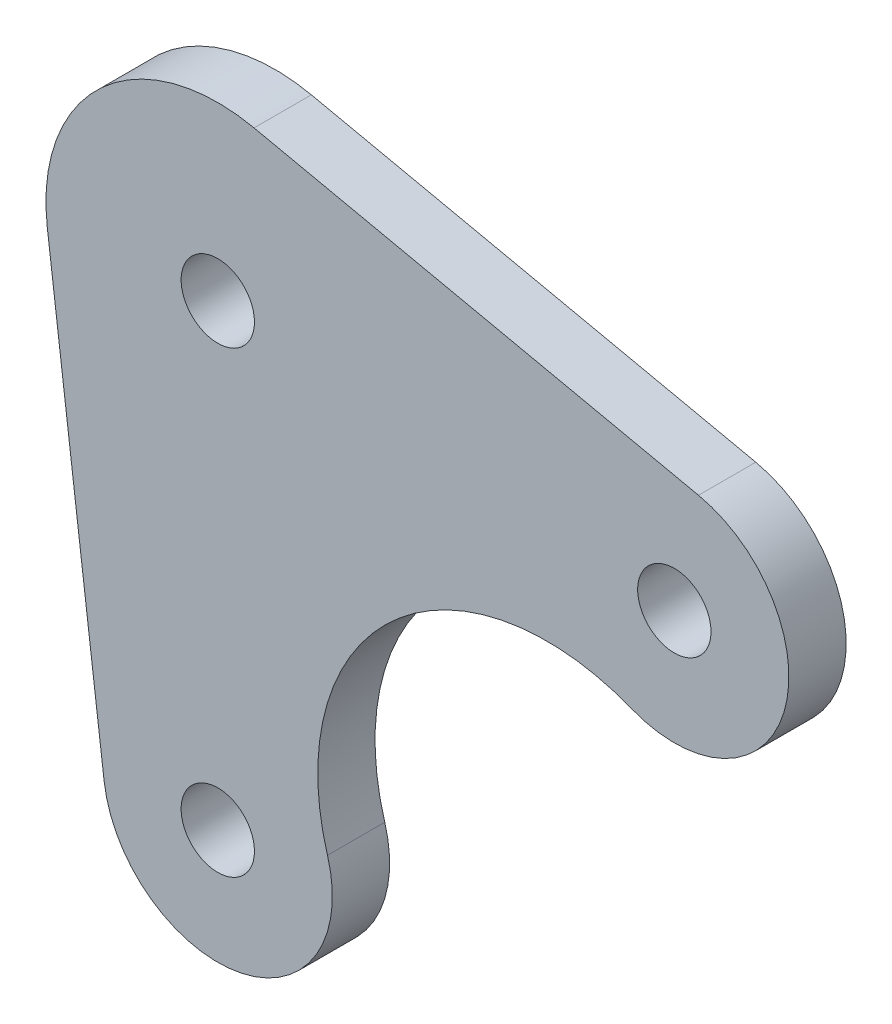
ISO-10303-21;
HEADER;
FILE_DESCRIPTION(('STEP AP214'),'2;1');
FILE_NAME('part.step','',(''),(''),'','','');
FILE_SCHEMA(('AUTOMOTIVE_DESIGN { 1 0 10303 214 1 1 1 1 }'));
ENDSEC;
DATA;
#1=APPLICATION_CONTEXT('core data for automotive mechanical design processes');
#2=APPLICATION_PROTOCOL_DEFINITION('international standard','automotive_design',2000,#1);
#3=PRODUCT_CONTEXT('',#1,'mechanical');
#4=PRODUCT('Part','Part','',(#3));
#5=PRODUCT_RELATED_PRODUCT_CATEGORY('part','',(#4));
#6=PRODUCT_DEFINITION_FORMATION('','',#4);
#7=PRODUCT_DEFINITION_CONTEXT('part definition',#1,'design');
#8=PRODUCT_DEFINITION('design','',#6,#7);
#9=PRODUCT_DEFINITION_SHAPE('','',#8);
#10=(LENGTH_UNIT() NAMED_UNIT(*) SI_UNIT(.MILLI.,.METRE.));
#11=(NAMED_UNIT(*) PLANE_ANGLE_UNIT() SI_UNIT($,.RADIAN.));
#12=(NAMED_UNIT(*) SI_UNIT($,.STERADIAN.) SOLID_ANGLE_UNIT());
#13=UNCERTAINTY_MEASURE_WITH_UNIT(LENGTH_MEASURE(1.E-05),#10,'distance_accuracy_value','');
#14=(GEOMETRIC_REPRESENTATION_CONTEXT(3) GLOBAL_UNCERTAINTY_ASSIGNED_CONTEXT((#13)) GLOBAL_UNIT_ASSIGNED_CONTEXT((#10,
#11,#12)) REPRESENTATION_CONTEXT('',''));
#15=CARTESIAN_POINT('',(0.,0.,0.));
#16=DIRECTION('',(0.,0.,1.));
#17=DIRECTION('',(1.,0.,0.));
#18=AXIS2_PLACEMENT_3D('',#15,#16,#17);
#19=CARTESIAN_POINT('',(0.,0.,3.175));
#20=DIRECTION('',(0.,0.,1.));
#21=DIRECTION('',(1.,0.,0.));
#22=AXIS2_PLACEMENT_3D('',#19,#20,#21);
#23=PLANE('',#22);
#24=CARTESIAN_POINT('',(25.3033453315303,-2.21375586579061,3.175));
#25=DIRECTION('',(0.,0.,1.));
#26=DIRECTION('',(1.,0.,0.));
#27=AXIS2_PLACEMENT_3D('',#24,#25,#26);
#28=CIRCLE('',#27,2.032);
#29=CARTESIAN_POINT('',(27.3353453315303,-2.21375586579061,3.175));
#30=VERTEX_POINT('',#29);
#31=EDGE_CURVE('E190',#30,#30,#28,.T.);
#32=ORIENTED_EDGE('',*,*,#31,.F.);
#33=EDGE_LOOP('',(#32));
#34=FACE_BOUND('',#33,.T.);
#35=CARTESIAN_POINT('',(0.,0.,3.175));
#36=DIRECTION('',(0.,0.,1.));
#37=DIRECTION('',(1.,0.,0.));
#38=AXIS2_PLACEMENT_3D('',#35,#36,#37);
#39=CIRCLE('',#38,9.525);
#40=CARTESIAN_POINT('',(2.00974161489411,9.31056194014963,3.175));
#41=VERTEX_POINT('',#40);
#42=CARTESIAN_POINT('',(-9.45029296420883,-1.190625,3.175));
#43=VERTEX_POINT('',#42);
#44=EDGE_CURVE('E135',#41,#43,#39,.T.);
#45=ORIENTED_EDGE('',*,*,#44,.T.);
#46=DIRECTION('',(0.125,-0.992156741649221,0.));
#47=VECTOR('',#46,1.);
#48=CARTESIAN_POINT('',(-6.30019530947255,-26.19375,3.175));
#49=LINE('',#48,#47);
#50=CARTESIAN_POINT('',(-6.30019530947255,-26.19375,3.175));
#51=VERTEX_POINT('',#50);
#52=EDGE_CURVE('E93',#43,#51,#49,.T.);
#53=ORIENTED_EDGE('',*,*,#52,.T.);
#54=CARTESIAN_POINT('',(0.,-25.4,3.175));
#55=DIRECTION('',(0.,0.,1.));
#56=DIRECTION('',(1.,0.,0.));
#57=AXIS2_PLACEMENT_3D('',#54,#55,#56);
#58=CIRCLE('',#57,6.35);
#59=CARTESIAN_POINT('',(6.0802042799938,-23.5687119523284,3.175));
#60=VERTEX_POINT('',#59);
#61=EDGE_CURVE('E106',#51,#60,#58,.T.);
#62=ORIENTED_EDGE('',*,*,#61,.T.);
#63=CARTESIAN_POINT('',(18.2406128399814,-19.9061358569851,3.175));
#64=DIRECTION('',(0.,0.,-1.));
#65=DIRECTION('',(1.,0.,0.));
#66=AXIS2_PLACEMENT_3D('',#63,#64,#65);
#67=CIRCLE('',#66,12.7);
#68=CARTESIAN_POINT('',(22.9491011676807,-8.11121586285545,3.175));
#69=VERTEX_POINT('',#68);
#70=EDGE_CURVE('E100',#60,#69,#67,.T.);
#71=ORIENTED_EDGE('',*,*,#70,.T.);
#72=CARTESIAN_POINT('',(25.3033453315303,-2.21375586579061,3.175));
#73=DIRECTION('',(0.,0.,1.));
#74=DIRECTION('',(-1.,0.,0.));
#75=AXIS2_PLACEMENT_3D('',#72,#73,#74);
#76=CIRCLE('',#75,6.35);
#77=CARTESIAN_POINT('',(26.6431730747931,3.99328542764247,3.175));
#78=VERTEX_POINT('',#77);
#79=EDGE_CURVE('E104',#69,#78,#76,.T.);
#80=ORIENTED_EDGE('',*,*,#79,.T.);
#81=DIRECTION('',(-0.977486817863478,0.210996495002006,0.));
#82=VECTOR('',#81,1.);
#83=CARTESIAN_POINT('',(2.00974161489411,9.31056194014963,3.175));
#84=LINE('',#83,#82);
#85=EDGE_CURVE('E56',#78,#41,#84,.T.);
#86=ORIENTED_EDGE('',*,*,#85,.T.);
#87=EDGE_LOOP('',(#45,#53,#62,#71,#80,#86));
#88=FACE_BOUND('',#87,.T.);
#89=CARTESIAN_POINT('',(0.,0.,3.175));
#90=DIRECTION('',(0.,0.,1.));
#91=DIRECTION('',(1.,0.,0.));
#92=AXIS2_PLACEMENT_3D('',#89,#90,#91);
#93=CIRCLE('',#92,2.032);
#94=CARTESIAN_POINT('',(2.032,0.,3.175));
#95=VERTEX_POINT('',#94);
#96=EDGE_CURVE('E128',#95,#95,#93,.T.);
#97=ORIENTED_EDGE('',*,*,#96,.F.);
#98=EDGE_LOOP('',(#97));
#99=FACE_BOUND('',#98,.T.);
#100=CARTESIAN_POINT('',(0.,-25.4,3.175));
#101=DIRECTION('',(0.,0.,1.));
#102=DIRECTION('',(1.,0.,0.));
#103=AXIS2_PLACEMENT_3D('',#100,#101,#102);
#104=CIRCLE('',#103,2.032);
#105=CARTESIAN_POINT('',(2.032,-25.4,3.175));
#106=VERTEX_POINT('',#105);
#107=EDGE_CURVE('E181',#106,#106,#104,.T.);
#108=ORIENTED_EDGE('',*,*,#107,.F.);
#109=EDGE_LOOP('',(#108));
#110=FACE_BOUND('',#109,.T.);
#111=ADVANCED_FACE('F39',(#34,#88,#99,#110),#23,.T.);
#112=CARTESIAN_POINT('',(0.,0.,0.));
#113=DIRECTION('',(0.,0.,1.));
#114=DIRECTION('',(1.,0.,0.));
#115=AXIS2_PLACEMENT_3D('',#112,#113,#114);
#116=PLANE('',#115);
#117=CARTESIAN_POINT('',(0.,0.,0.));
#118=DIRECTION('',(0.,0.,1.));
#119=DIRECTION('',(1.,0.,0.));
#120=AXIS2_PLACEMENT_3D('',#117,#118,#119);
#121=CIRCLE('',#120,9.525);
#122=CARTESIAN_POINT('',(2.00974161489411,9.31056194014963,0.));
#123=VERTEX_POINT('',#122);
#124=CARTESIAN_POINT('',(-9.45029296420883,-1.190625,0.));
#125=VERTEX_POINT('',#124);
#126=EDGE_CURVE('E124',#123,#125,#121,.T.);
#127=ORIENTED_EDGE('',*,*,#126,.F.);
#128=DIRECTION('',(-0.977486817863478,0.210996495002006,0.));
#129=VECTOR('',#128,1.);
#130=CARTESIAN_POINT('',(2.00974161489411,9.31056194014963,0.));
#131=LINE('',#130,#129);
#132=CARTESIAN_POINT('',(26.6431730747931,3.99328542764247,0.));
#133=VERTEX_POINT('',#132);
#134=EDGE_CURVE('E85',#133,#123,#131,.T.);
#135=ORIENTED_EDGE('',*,*,#134,.F.);
#136=CARTESIAN_POINT('',(25.3033453315303,-2.21375586579061,0.));
#137=DIRECTION('',(0.,0.,1.));
#138=DIRECTION('',(-1.,0.,0.));
#139=AXIS2_PLACEMENT_3D('',#136,#137,#138);
#140=CIRCLE('',#139,6.35);
#141=CARTESIAN_POINT('',(22.9491011676807,-8.11121586285545,0.));
#142=VERTEX_POINT('',#141);
#143=EDGE_CURVE('E79',#142,#133,#140,.T.);
#144=ORIENTED_EDGE('',*,*,#143,.F.);
#145=CARTESIAN_POINT('',(18.2406128399814,-19.9061358569851,0.));
#146=DIRECTION('',(0.,0.,-1.));
#147=DIRECTION('',(1.,0.,0.));
#148=AXIS2_PLACEMENT_3D('',#145,#146,#147);
#149=CIRCLE('',#148,12.7);
#150=CARTESIAN_POINT('',(6.0802042799938,-23.5687119523284,0.));
#151=VERTEX_POINT('',#150);
#152=EDGE_CURVE('E114',#151,#142,#149,.T.);
#153=ORIENTED_EDGE('',*,*,#152,.F.);
#154=CARTESIAN_POINT('',(0.,-25.4,0.));
#155=DIRECTION('',(0.,0.,1.));
#156=DIRECTION('',(1.,0.,0.));
#157=AXIS2_PLACEMENT_3D('',#154,#155,#156);
#158=CIRCLE('',#157,6.35);
#159=CARTESIAN_POINT('',(-6.30019530947255,-26.19375,0.));
#160=VERTEX_POINT('',#159);
#161=EDGE_CURVE('E130',#160,#151,#158,.T.);
#162=ORIENTED_EDGE('',*,*,#161,.F.);
#163=DIRECTION('',(0.125,-0.992156741649221,0.));
#164=VECTOR('',#163,1.);
#165=CARTESIAN_POINT('',(-6.30019530947255,-26.19375,0.));
#166=LINE('',#165,#164);
#167=EDGE_CURVE('E127',#125,#160,#166,.T.);
#168=ORIENTED_EDGE('',*,*,#167,.F.);
#169=EDGE_LOOP('',(#127,#135,#144,#153,#162,#168));
#170=FACE_BOUND('',#169,.T.);
#171=CARTESIAN_POINT('',(0.,0.,0.));
#172=DIRECTION('',(0.,0.,1.));
#173=DIRECTION('',(1.,0.,0.));
#174=AXIS2_PLACEMENT_3D('',#171,#172,#173);
#175=CIRCLE('',#174,2.032);
#176=CARTESIAN_POINT('',(2.032,0.,0.));
#177=VERTEX_POINT('',#176);
#178=EDGE_CURVE('E193',#177,#177,#175,.T.);
#179=ORIENTED_EDGE('',*,*,#178,.T.);
#180=EDGE_LOOP('',(#179));
#181=FACE_BOUND('',#180,.T.);
#182=CARTESIAN_POINT('',(25.3033453315303,-2.21375586579061,0.));
#183=DIRECTION('',(0.,0.,1.));
#184=DIRECTION('',(1.,0.,0.));
#185=AXIS2_PLACEMENT_3D('',#182,#183,#184);
#186=CIRCLE('',#185,2.032);
#187=CARTESIAN_POINT('',(27.3353453315303,-2.21375586579061,0.));
#188=VERTEX_POINT('',#187);
#189=EDGE_CURVE('E187',#188,#188,#186,.T.);
#190=ORIENTED_EDGE('',*,*,#189,.T.);
#191=EDGE_LOOP('',(#190));
#192=FACE_BOUND('',#191,.T.);
#193=CARTESIAN_POINT('',(0.,-25.4,0.));
#194=DIRECTION('',(0.,0.,1.));
#195=DIRECTION('',(1.,0.,0.));
#196=AXIS2_PLACEMENT_3D('',#193,#194,#195);
#197=CIRCLE('',#196,2.032);
#198=CARTESIAN_POINT('',(2.032,-25.4,0.));
#199=VERTEX_POINT('',#198);
#200=EDGE_CURVE('E184',#199,#199,#197,.T.);
#201=ORIENTED_EDGE('',*,*,#200,.T.);
#202=EDGE_LOOP('',(#201));
#203=FACE_BOUND('',#202,.T.);
#204=ADVANCED_FACE('F144',(#170,#181,#192,#203),#116,.F.);
#205=CARTESIAN_POINT('',(0.,0.,3.175));
#206=DIRECTION('',(0.,0.,-1.));
#207=DIRECTION('',(-1.,0.,0.));
#208=AXIS2_PLACEMENT_3D('',#205,#206,#207);
#209=CYLINDRICAL_SURFACE('',#208,9.525);
#210=ORIENTED_EDGE('',*,*,#126,.T.);
#211=DIRECTION('',(0.,0.,-1.));
#212=VECTOR('',#211,1.);
#213=CARTESIAN_POINT('',(-9.45029296420883,-1.190625,3.175));
#214=LINE('',#213,#212);
#215=EDGE_CURVE('E11',#43,#125,#214,.T.);
#216=ORIENTED_EDGE('',*,*,#215,.F.);
#217=ORIENTED_EDGE('',*,*,#44,.F.);
#218=DIRECTION('',(0.,0.,-1.));
#219=VECTOR('',#218,1.);
#220=CARTESIAN_POINT('',(2.00974161489411,9.31056194014963,3.175));
#221=LINE('',#220,#219);
#222=EDGE_CURVE('E120',#41,#123,#221,.T.);
#223=ORIENTED_EDGE('',*,*,#222,.T.);
#224=EDGE_LOOP('',(#210,#216,#217,#223));
#225=FACE_BOUND('',#224,.T.);
#226=ADVANCED_FACE('F41',(#225),#209,.T.);
#227=CARTESIAN_POINT('',(-6.30019530947255,-26.19375,3.175));
#228=DIRECTION('',(0.992156741649221,0.125,0.));
#229=DIRECTION('',(-0.125,0.992156741649222,0.));
#230=AXIS2_PLACEMENT_3D('',#227,#228,#229);
#231=PLANE('',#230);
#232=ORIENTED_EDGE('',*,*,#167,.T.);
#233=DIRECTION('',(0.,0.,-1.));
#234=VECTOR('',#233,1.);
#235=CARTESIAN_POINT('',(-6.30019530947255,-26.19375,3.175));
#236=LINE('',#235,#234);
#237=EDGE_CURVE('E48',#51,#160,#236,.T.);
#238=ORIENTED_EDGE('',*,*,#237,.F.);
#239=ORIENTED_EDGE('',*,*,#52,.F.);
#240=ORIENTED_EDGE('',*,*,#215,.T.);
#241=EDGE_LOOP('',(#232,#238,#239,#240));
#242=FACE_BOUND('',#241,.T.);
#243=ADVANCED_FACE('F246',(#242),#231,.F.);
#244=CARTESIAN_POINT('',(0.,-25.4,3.175));
#245=DIRECTION('',(0.,0.,-1.));
#246=DIRECTION('',(-1.,0.,0.));
#247=AXIS2_PLACEMENT_3D('',#244,#245,#246);
#248=CYLINDRICAL_SURFACE('',#247,6.35);
#249=ORIENTED_EDGE('',*,*,#161,.T.);
#250=DIRECTION('',(0.,0.,-1.));
#251=VECTOR('',#250,1.);
#252=CARTESIAN_POINT('',(6.0802042799938,-23.5687119523284,3.175));
#253=LINE('',#252,#251);
#254=EDGE_CURVE('E115',#60,#151,#253,.T.);
#255=ORIENTED_EDGE('',*,*,#254,.F.);
#256=ORIENTED_EDGE('',*,*,#61,.F.);
#257=ORIENTED_EDGE('',*,*,#237,.T.);
#258=EDGE_LOOP('',(#249,#255,#256,#257));
#259=FACE_BOUND('',#258,.T.);
#260=ADVANCED_FACE('F141',(#259),#248,.T.);
#261=CARTESIAN_POINT('',(18.2406128399814,-19.9061358569851,3.175));
#262=DIRECTION('',(0.,0.,-1.));
#263=DIRECTION('',(-1.,0.,0.));
#264=AXIS2_PLACEMENT_3D('',#261,#262,#263);
#265=CYLINDRICAL_SURFACE('',#264,12.7);
#266=ORIENTED_EDGE('',*,*,#152,.T.);
#267=DIRECTION('',(0.,0.,-1.));
#268=VECTOR('',#267,1.);
#269=CARTESIAN_POINT('',(22.9491011676807,-8.11121586285545,3.175));
#270=LINE('',#269,#268);
#271=EDGE_CURVE('E111',#69,#142,#270,.T.);
#272=ORIENTED_EDGE('',*,*,#271,.F.);
#273=ORIENTED_EDGE('',*,*,#70,.F.);
#274=ORIENTED_EDGE('',*,*,#254,.T.);
#275=EDGE_LOOP('',(#266,#272,#273,#274));
#276=FACE_BOUND('',#275,.T.);
#277=ADVANCED_FACE('F112',(#276),#265,.F.);
#278=CARTESIAN_POINT('',(25.3033453315303,-2.21375586579061,3.175));
#279=DIRECTION('',(0.,0.,-1.));
#280=DIRECTION('',(-1.,0.,0.));
#281=AXIS2_PLACEMENT_3D('',#278,#279,#280);
#282=CYLINDRICAL_SURFACE('',#281,6.35);
#283=ORIENTED_EDGE('',*,*,#143,.T.);
#284=DIRECTION('',(0.,0.,-1.));
#285=VECTOR('',#284,1.);
#286=CARTESIAN_POINT('',(26.6431730747931,3.99328542764247,3.175));
#287=LINE('',#286,#285);
#288=EDGE_CURVE('E116',#78,#133,#287,.T.);
#289=ORIENTED_EDGE('',*,*,#288,.F.);
#290=ORIENTED_EDGE('',*,*,#79,.F.);
#291=ORIENTED_EDGE('',*,*,#271,.T.);
#292=EDGE_LOOP('',(#283,#289,#290,#291));
#293=FACE_BOUND('',#292,.T.);
#294=ADVANCED_FACE('F118',(#293),#282,.T.);
#295=CARTESIAN_POINT('',(2.00974161489411,9.31056194014963,3.175));
#296=DIRECTION('',(-0.210996495002006,-0.977486817863478,0.));
#297=DIRECTION('',(0.977486817863478,-0.210996495002006,0.));
#298=AXIS2_PLACEMENT_3D('',#295,#296,#297);
#299=PLANE('',#298);
#300=ORIENTED_EDGE('',*,*,#134,.T.);
#301=ORIENTED_EDGE('',*,*,#222,.F.);
#302=ORIENTED_EDGE('',*,*,#85,.F.);
#303=ORIENTED_EDGE('',*,*,#288,.T.);
#304=EDGE_LOOP('',(#300,#301,#302,#303));
#305=FACE_BOUND('',#304,.T.);
#306=ADVANCED_FACE('F149',(#305),#299,.F.);
#307=CARTESIAN_POINT('',(0.,0.,3.175));
#308=DIRECTION('',(0.,0.,-1.));
#309=DIRECTION('',(-1.,0.,0.));
#310=AXIS2_PLACEMENT_3D('',#307,#308,#309);
#311=CYLINDRICAL_SURFACE('',#310,2.032);
#312=ORIENTED_EDGE('',*,*,#96,.T.);
#313=EDGE_LOOP('',(#312));
#314=FACE_BOUND('',#313,.T.);
#315=ORIENTED_EDGE('',*,*,#178,.F.);
#316=EDGE_LOOP('',(#315));
#317=FACE_BOUND('',#316,.T.);
#318=ADVANCED_FACE('F151',(#314,#317),#311,.F.);
#319=CARTESIAN_POINT('',(25.3033453315303,-2.21375586579061,3.175));
#320=DIRECTION('',(0.,0.,-1.));
#321=DIRECTION('',(-1.,0.,0.));
#322=AXIS2_PLACEMENT_3D('',#319,#320,#321);
#323=CYLINDRICAL_SURFACE('',#322,2.032);
#324=ORIENTED_EDGE('',*,*,#31,.T.);
#325=EDGE_LOOP('',(#324));
#326=FACE_BOUND('',#325,.T.);
#327=ORIENTED_EDGE('',*,*,#189,.F.);
#328=EDGE_LOOP('',(#327));
#329=FACE_BOUND('',#328,.T.);
#330=ADVANCED_FACE('F157',(#326,#329),#323,.F.);
#331=CARTESIAN_POINT('',(0.,-25.4,3.175));
#332=DIRECTION('',(0.,0.,-1.));
#333=DIRECTION('',(-1.,0.,0.));
#334=AXIS2_PLACEMENT_3D('',#331,#332,#333);
#335=CYLINDRICAL_SURFACE('',#334,2.032);
#336=ORIENTED_EDGE('',*,*,#107,.T.);
#337=EDGE_LOOP('',(#336));
#338=FACE_BOUND('',#337,.T.);
#339=ORIENTED_EDGE('',*,*,#200,.F.);
#340=EDGE_LOOP('',(#339));
#341=FACE_BOUND('',#340,.T.);
#342=ADVANCED_FACE('F172',(#338,#341),#335,.F.);
#343=CLOSED_SHELL('',(#111,#204,#226,#243,#260,#277,#294,#306,#318,#330,#342));
#344=MANIFOLD_SOLID_BREP('B2',#343);
#345=ADVANCED_BREP_SHAPE_REPRESENTATION('',(#18,#344),#14);
#346=SHAPE_DEFINITION_REPRESENTATION(#9,#345);
ENDSEC;
END-ISO-10303-21;
